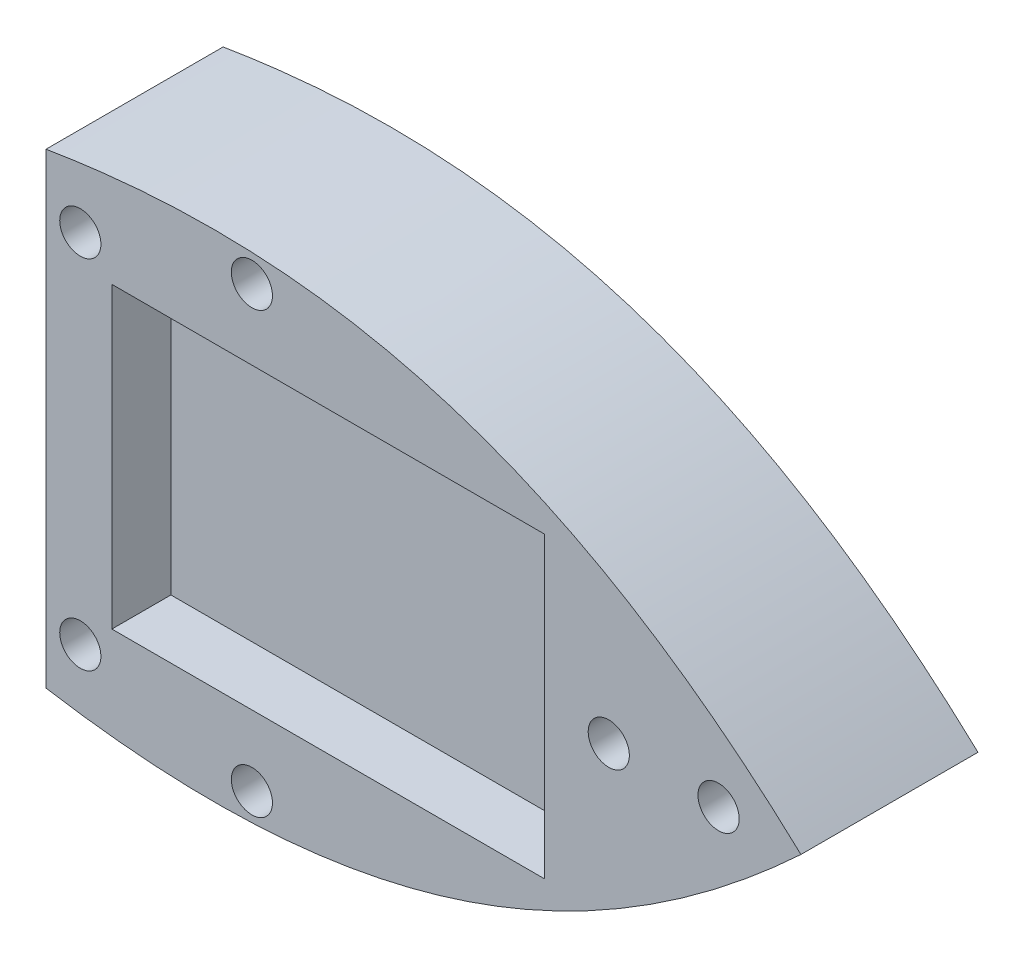
ISO-10303-21;
HEADER;
FILE_DESCRIPTION(('STEP AP214'),'2;1');
FILE_NAME('part.step','',(''),(''),'','','');
FILE_SCHEMA(('AUTOMOTIVE_DESIGN { 1 0 10303 214 1 1 1 1 }'));
ENDSEC;
DATA;
#1=APPLICATION_CONTEXT('core data for automotive mechanical design processes');
#2=APPLICATION_PROTOCOL_DEFINITION('international standard','automotive_design',2000,#1);
#3=PRODUCT_CONTEXT('',#1,'mechanical');
#4=PRODUCT('Part','Part','',(#3));
#5=PRODUCT_RELATED_PRODUCT_CATEGORY('part','',(#4));
#6=PRODUCT_DEFINITION_FORMATION('','',#4);
#7=PRODUCT_DEFINITION_CONTEXT('part definition',#1,'design');
#8=PRODUCT_DEFINITION('design','',#6,#7);
#9=PRODUCT_DEFINITION_SHAPE('','',#8);
#10=(LENGTH_UNIT() NAMED_UNIT(*) SI_UNIT(.MILLI.,.METRE.));
#11=(NAMED_UNIT(*) PLANE_ANGLE_UNIT() SI_UNIT($,.RADIAN.));
#12=(NAMED_UNIT(*) SI_UNIT($,.STERADIAN.) SOLID_ANGLE_UNIT());
#13=UNCERTAINTY_MEASURE_WITH_UNIT(LENGTH_MEASURE(1.E-05),#10,'distance_accuracy_value','');
#14=(GEOMETRIC_REPRESENTATION_CONTEXT(3) GLOBAL_UNCERTAINTY_ASSIGNED_CONTEXT((#13)) GLOBAL_UNIT_ASSIGNED_CONTEXT((#10,
#11,#12)) REPRESENTATION_CONTEXT('',''));
#15=CARTESIAN_POINT('',(0.,0.,0.));
#16=DIRECTION('',(0.,0.,1.));
#17=DIRECTION('',(1.,0.,0.));
#18=AXIS2_PLACEMENT_3D('',#15,#16,#17);
#19=CARTESIAN_POINT('',(1.27377448257759,15.7223087062875,12.9));
#20=DIRECTION('',(0.,0.,1.));
#21=DIRECTION('',(1.,0.,0.));
#22=AXIS2_PLACEMENT_3D('',#19,#20,#21);
#23=PLANE('',#22);
#24=CARTESIAN_POINT('',(-12.5,-16.,12.9));
#25=DIRECTION('',(0.,0.,1.));
#26=DIRECTION('',(-1.,0.,0.));
#27=AXIS2_PLACEMENT_3D('',#24,#25,#26);
#28=CIRCLE('',#27,1.5);
#29=CARTESIAN_POINT('',(-14.,-16.,12.9));
#30=VERTEX_POINT('',#29);
#31=EDGE_CURVE('E162',#30,#30,#28,.T.);
#32=ORIENTED_EDGE('',*,*,#31,.F.);
#33=EDGE_LOOP('',(#32));
#34=FACE_BOUND('',#33,.T.);
#35=CARTESIAN_POINT('',(21.5,0.,12.9));
#36=DIRECTION('',(0.,0.,1.));
#37=DIRECTION('',(1.,0.,0.));
#38=AXIS2_PLACEMENT_3D('',#35,#36,#37);
#39=CIRCLE('',#38,1.5);
#40=CARTESIAN_POINT('',(20.,0.,12.9));
#41=VERTEX_POINT('',#40);
#42=EDGE_CURVE('E178',#41,#41,#39,.T.);
#43=ORIENTED_EDGE('',*,*,#42,.F.);
#44=EDGE_LOOP('',(#43));
#45=FACE_BOUND('',#44,.T.);
#46=CARTESIAN_POINT('',(-25.,13.,12.9));
#47=DIRECTION('',(0.,0.,1.));
#48=DIRECTION('',(1.,0.,0.));
#49=AXIS2_PLACEMENT_3D('',#46,#47,#48);
#50=CIRCLE('',#49,1.5);
#51=CARTESIAN_POINT('',(-26.5,13.,12.9));
#52=VERTEX_POINT('',#51);
#53=EDGE_CURVE('E194',#52,#52,#50,.T.);
#54=ORIENTED_EDGE('',*,*,#53,.F.);
#55=EDGE_LOOP('',(#54));
#56=FACE_BOUND('',#55,.T.);
#57=CARTESIAN_POINT('',(27.5,0.,12.9));
#58=CARTESIAN_POINT('',(10.5144592111062,15.8596669110894,12.9));
#59=CARTESIAN_POINT('',(-7.11772725756596,20.399822972344,12.9));
#60=CARTESIAN_POINT('',(-27.5,17.,12.9));
#61=B_SPLINE_CURVE_WITH_KNOTS('',3,(#57,#58,#59,#60),.UNSPECIFIED.,.F.,.F.,(4,4),(0.,1.),.UNSPECIFIED.);
#62=CARTESIAN_POINT('',(27.5,0.,12.9));
#63=VERTEX_POINT('',#62);
#64=CARTESIAN_POINT('',(-27.5,17.,12.9));
#65=VERTEX_POINT('',#64);
#66=EDGE_CURVE('E201',#63,#65,#61,.T.);
#67=ORIENTED_EDGE('',*,*,#66,.T.);
#68=DIRECTION('',(0.,-1.,0.));
#69=VECTOR('',#68,1.);
#70=CARTESIAN_POINT('',(-27.5,-17.,12.9));
#71=LINE('',#70,#69);
#72=CARTESIAN_POINT('',(-27.5,-17.,12.9));
#73=VERTEX_POINT('',#72);
#74=EDGE_CURVE('E208',#65,#73,#71,.T.);
#75=ORIENTED_EDGE('',*,*,#74,.T.);
#76=CARTESIAN_POINT('',(-27.5,-17.,12.9));
#77=CARTESIAN_POINT('',(-7.11772725756596,-20.399822972344,12.9));
#78=CARTESIAN_POINT('',(10.5144592111062,-15.8596669110894,12.9));
#79=CARTESIAN_POINT('',(27.5,0.,12.9));
#80=B_SPLINE_CURVE_WITH_KNOTS('',3,(#76,#77,#78,#79),.UNSPECIFIED.,.F.,.F.,(4,4),(0.,1.),.UNSPECIFIED.);
#81=EDGE_CURVE('E215',#73,#63,#80,.T.);
#82=ORIENTED_EDGE('',*,*,#81,.T.);
#83=EDGE_LOOP('',(#67,#75,#82));
#84=FACE_BOUND('',#83,.T.);
#85=CARTESIAN_POINT('',(-12.5,16.,12.9));
#86=DIRECTION('',(0.,0.,1.));
#87=DIRECTION('',(1.,0.,0.));
#88=AXIS2_PLACEMENT_3D('',#85,#86,#87);
#89=CIRCLE('',#88,1.5);
#90=CARTESIAN_POINT('',(-14.,16.,12.9));
#91=VERTEX_POINT('',#90);
#92=EDGE_CURVE('E186',#91,#91,#89,.T.);
#93=ORIENTED_EDGE('',*,*,#92,.F.);
#94=EDGE_LOOP('',(#93));
#95=FACE_BOUND('',#94,.T.);
#96=CARTESIAN_POINT('',(13.5,0.,12.9));
#97=DIRECTION('',(0.,0.,1.));
#98=DIRECTION('',(1.,0.,0.));
#99=AXIS2_PLACEMENT_3D('',#96,#97,#98);
#100=CIRCLE('',#99,1.5);
#101=CARTESIAN_POINT('',(12.,0.,12.9));
#102=VERTEX_POINT('',#101);
#103=EDGE_CURVE('E170',#102,#102,#100,.T.);
#104=ORIENTED_EDGE('',*,*,#103,.F.);
#105=EDGE_LOOP('',(#104));
#106=FACE_BOUND('',#105,.T.);
#107=CARTESIAN_POINT('',(-25.,-13.,12.9));
#108=DIRECTION('',(0.,0.,1.));
#109=DIRECTION('',(-1.,0.,0.));
#110=AXIS2_PLACEMENT_3D('',#107,#108,#109);
#111=CIRCLE('',#110,1.5);
#112=CARTESIAN_POINT('',(-26.5,-13.,12.9));
#113=VERTEX_POINT('',#112);
#114=EDGE_CURVE('E154',#113,#113,#111,.T.);
#115=ORIENTED_EDGE('',*,*,#114,.F.);
#116=EDGE_LOOP('',(#115));
#117=FACE_BOUND('',#116,.T.);
#118=DIRECTION('',(1.,0.,0.));
#119=VECTOR('',#118,1.);
#120=CARTESIAN_POINT('',(8.8,-10.875,12.9));
#121=LINE('',#120,#119);
#122=CARTESIAN_POINT('',(-22.7,-10.875,12.9));
#123=VERTEX_POINT('',#122);
#124=CARTESIAN_POINT('',(8.8,-10.875,12.9));
#125=VERTEX_POINT('',#124);
#126=EDGE_CURVE('E137',#123,#125,#121,.T.);
#127=ORIENTED_EDGE('',*,*,#126,.F.);
#128=DIRECTION('',(0.,-1.,0.));
#129=VECTOR('',#128,1.);
#130=CARTESIAN_POINT('',(-22.7,-10.875,12.9));
#131=LINE('',#130,#129);
#132=CARTESIAN_POINT('',(-22.7,10.875,12.9));
#133=VERTEX_POINT('',#132);
#134=EDGE_CURVE('E134',#133,#123,#131,.T.);
#135=ORIENTED_EDGE('',*,*,#134,.F.);
#136=DIRECTION('',(-1.,0.,0.));
#137=VECTOR('',#136,1.);
#138=CARTESIAN_POINT('',(8.8,10.875,12.9));
#139=LINE('',#138,#137);
#140=CARTESIAN_POINT('',(8.8,10.875,12.9));
#141=VERTEX_POINT('',#140);
#142=EDGE_CURVE('E113',#141,#133,#139,.T.);
#143=ORIENTED_EDGE('',*,*,#142,.F.);
#144=DIRECTION('',(0.,1.,0.));
#145=VECTOR('',#144,1.);
#146=CARTESIAN_POINT('',(8.8,-10.875,12.9));
#147=LINE('',#146,#145);
#148=EDGE_CURVE('E140',#125,#141,#147,.T.);
#149=ORIENTED_EDGE('',*,*,#148,.F.);
#150=EDGE_LOOP('',(#127,#135,#143,#149));
#151=FACE_BOUND('',#150,.T.);
#152=ADVANCED_FACE('F44',(#34,#45,#56,#84,#95,#106,#117,#151),#23,.T.);
#153=CARTESIAN_POINT('',(1.27377448257759,15.7223087062875,0.));
#154=DIRECTION('',(0.,0.,1.));
#155=DIRECTION('',(1.,0.,0.));
#156=AXIS2_PLACEMENT_3D('',#153,#154,#155);
#157=PLANE('',#156);
#158=CARTESIAN_POINT('',(-25.,-13.,0.));
#159=DIRECTION('',(0.,0.,1.));
#160=DIRECTION('',(-1.,0.,0.));
#161=AXIS2_PLACEMENT_3D('',#158,#159,#160);
#162=CIRCLE('',#161,1.5);
#163=CARTESIAN_POINT('',(-26.5,-13.,0.));
#164=VERTEX_POINT('',#163);
#165=EDGE_CURVE('E153',#164,#164,#162,.T.);
#166=ORIENTED_EDGE('',*,*,#165,.T.);
#167=EDGE_LOOP('',(#166));
#168=FACE_BOUND('',#167,.T.);
#169=CARTESIAN_POINT('',(-12.5,-16.,0.));
#170=DIRECTION('',(0.,0.,1.));
#171=DIRECTION('',(-1.,0.,0.));
#172=AXIS2_PLACEMENT_3D('',#169,#170,#171);
#173=CIRCLE('',#172,1.5);
#174=CARTESIAN_POINT('',(-14.,-16.,0.));
#175=VERTEX_POINT('',#174);
#176=EDGE_CURVE('E158',#175,#175,#173,.T.);
#177=ORIENTED_EDGE('',*,*,#176,.T.);
#178=EDGE_LOOP('',(#177));
#179=FACE_BOUND('',#178,.T.);
#180=CARTESIAN_POINT('',(13.5,0.,0.));
#181=DIRECTION('',(0.,0.,1.));
#182=DIRECTION('',(1.,0.,0.));
#183=AXIS2_PLACEMENT_3D('',#180,#181,#182);
#184=CIRCLE('',#183,1.5);
#185=CARTESIAN_POINT('',(12.,0.,0.));
#186=VERTEX_POINT('',#185);
#187=EDGE_CURVE('E166',#186,#186,#184,.T.);
#188=ORIENTED_EDGE('',*,*,#187,.T.);
#189=EDGE_LOOP('',(#188));
#190=FACE_BOUND('',#189,.T.);
#191=CARTESIAN_POINT('',(21.5,0.,0.));
#192=DIRECTION('',(0.,0.,1.));
#193=DIRECTION('',(1.,0.,0.));
#194=AXIS2_PLACEMENT_3D('',#191,#192,#193);
#195=CIRCLE('',#194,1.5);
#196=CARTESIAN_POINT('',(20.,0.,0.));
#197=VERTEX_POINT('',#196);
#198=EDGE_CURVE('E174',#197,#197,#195,.T.);
#199=ORIENTED_EDGE('',*,*,#198,.T.);
#200=EDGE_LOOP('',(#199));
#201=FACE_BOUND('',#200,.T.);
#202=CARTESIAN_POINT('',(-12.5,16.,0.));
#203=DIRECTION('',(0.,0.,1.));
#204=DIRECTION('',(1.,0.,0.));
#205=AXIS2_PLACEMENT_3D('',#202,#203,#204);
#206=CIRCLE('',#205,1.5);
#207=CARTESIAN_POINT('',(-14.,16.,0.));
#208=VERTEX_POINT('',#207);
#209=EDGE_CURVE('E182',#208,#208,#206,.T.);
#210=ORIENTED_EDGE('',*,*,#209,.T.);
#211=EDGE_LOOP('',(#210));
#212=FACE_BOUND('',#211,.T.);
#213=CARTESIAN_POINT('',(-25.,13.,0.));
#214=DIRECTION('',(0.,0.,1.));
#215=DIRECTION('',(1.,0.,0.));
#216=AXIS2_PLACEMENT_3D('',#213,#214,#215);
#217=CIRCLE('',#216,1.5);
#218=CARTESIAN_POINT('',(-26.5,13.,0.));
#219=VERTEX_POINT('',#218);
#220=EDGE_CURVE('E190',#219,#219,#217,.T.);
#221=ORIENTED_EDGE('',*,*,#220,.T.);
#222=EDGE_LOOP('',(#221));
#223=FACE_BOUND('',#222,.T.);
#224=CARTESIAN_POINT('',(27.5,0.,0.));
#225=CARTESIAN_POINT('',(10.5144592111062,15.8596669110894,0.));
#226=CARTESIAN_POINT('',(-7.11772725756596,20.399822972344,0.));
#227=CARTESIAN_POINT('',(-27.5,17.,0.));
#228=B_SPLINE_CURVE_WITH_KNOTS('',3,(#224,#225,#226,#227),.UNSPECIFIED.,.F.,.F.,(4,4),(0.,1.),.UNSPECIFIED.);
#229=CARTESIAN_POINT('',(27.5,0.,0.));
#230=VERTEX_POINT('',#229);
#231=CARTESIAN_POINT('',(-27.5,17.,0.));
#232=VERTEX_POINT('',#231);
#233=EDGE_CURVE('E198',#230,#232,#228,.T.);
#234=ORIENTED_EDGE('',*,*,#233,.F.);
#235=CARTESIAN_POINT('',(-27.5,-17.,0.));
#236=CARTESIAN_POINT('',(-7.11772725756596,-20.399822972344,0.));
#237=CARTESIAN_POINT('',(10.5144592111062,-15.8596669110894,0.));
#238=CARTESIAN_POINT('',(27.5,0.,0.));
#239=B_SPLINE_CURVE_WITH_KNOTS('',3,(#235,#236,#237,#238),.UNSPECIFIED.,.F.,.F.,(4,4),(0.,1.),.UNSPECIFIED.);
#240=CARTESIAN_POINT('',(-27.5,-17.,0.));
#241=VERTEX_POINT('',#240);
#242=EDGE_CURVE('E209',#241,#230,#239,.T.);
#243=ORIENTED_EDGE('',*,*,#242,.F.);
#244=DIRECTION('',(0.,-1.,0.));
#245=VECTOR('',#244,1.);
#246=CARTESIAN_POINT('',(-27.5,-17.,0.));
#247=LINE('',#246,#245);
#248=EDGE_CURVE('E430',#232,#241,#247,.T.);
#249=ORIENTED_EDGE('',*,*,#248,.F.);
#250=EDGE_LOOP('',(#234,#243,#249));
#251=FACE_BOUND('',#250,.T.);
#252=ADVANCED_FACE('F235',(#168,#179,#190,#201,#212,#223,#251),#157,.F.);
#253=DIRECTION('',(0.,0.,-1.));
#254=VECTOR('',#253,1.);
#255=SURFACE_OF_LINEAR_EXTRUSION('',#61,#254);
#256=ORIENTED_EDGE('',*,*,#233,.T.);
#257=DIRECTION('',(0.,0.,-1.));
#258=VECTOR('',#257,1.);
#259=CARTESIAN_POINT('',(-27.5,17.,12.9));
#260=LINE('',#259,#258);
#261=EDGE_CURVE('E11',#65,#232,#260,.T.);
#262=ORIENTED_EDGE('',*,*,#261,.F.);
#263=ORIENTED_EDGE('',*,*,#66,.F.);
#264=DIRECTION('',(0.,0.,-1.));
#265=VECTOR('',#264,1.);
#266=CARTESIAN_POINT('',(27.5,0.,12.9));
#267=LINE('',#266,#265);
#268=EDGE_CURVE('E221',#63,#230,#267,.T.);
#269=ORIENTED_EDGE('',*,*,#268,.T.);
#270=EDGE_LOOP('',(#256,#262,#263,#269));
#271=FACE_BOUND('',#270,.T.);
#272=ADVANCED_FACE('F46',(#271),#255,.F.);
#273=CARTESIAN_POINT('',(-27.5,-17.,12.9));
#274=DIRECTION('',(1.,0.,0.));
#275=DIRECTION('',(0.,0.,-1.));
#276=AXIS2_PLACEMENT_3D('',#273,#274,#275);
#277=PLANE('',#276);
#278=ORIENTED_EDGE('',*,*,#248,.T.);
#279=DIRECTION('',(0.,0.,-1.));
#280=VECTOR('',#279,1.);
#281=CARTESIAN_POINT('',(-27.5,-17.,12.9));
#282=LINE('',#281,#280);
#283=EDGE_CURVE('E54',#73,#241,#282,.T.);
#284=ORIENTED_EDGE('',*,*,#283,.F.);
#285=ORIENTED_EDGE('',*,*,#74,.F.);
#286=ORIENTED_EDGE('',*,*,#261,.T.);
#287=EDGE_LOOP('',(#278,#284,#285,#286));
#288=FACE_BOUND('',#287,.T.);
#289=ADVANCED_FACE('F233',(#288),#277,.F.);
#290=DIRECTION('',(0.,0.,-1.));
#291=VECTOR('',#290,1.);
#292=SURFACE_OF_LINEAR_EXTRUSION('',#80,#291);
#293=ORIENTED_EDGE('',*,*,#242,.T.);
#294=ORIENTED_EDGE('',*,*,#268,.F.);
#295=ORIENTED_EDGE('',*,*,#81,.F.);
#296=ORIENTED_EDGE('',*,*,#283,.T.);
#297=EDGE_LOOP('',(#293,#294,#295,#296));
#298=FACE_BOUND('',#297,.T.);
#299=ADVANCED_FACE('F229',(#298),#292,.F.);
#300=CARTESIAN_POINT('',(-25.,13.,12.9));
#301=DIRECTION('',(0.,0.,-1.));
#302=DIRECTION('',(-1.,0.,0.));
#303=AXIS2_PLACEMENT_3D('',#300,#301,#302);
#304=CYLINDRICAL_SURFACE('',#303,1.5);
#305=CARTESIAN_POINT('',(-26.5,13.,12.9));
#306=CARTESIAN_POINT('',(-26.5,13.,12.765625));
#307=CARTESIAN_POINT('',(-26.5,13.,12.63125));
#308=CARTESIAN_POINT('',(-26.5,13.,12.3625));
#309=CARTESIAN_POINT('',(-26.5,13.,12.228125));
#310=CARTESIAN_POINT('',(-26.5,13.,11.959375));
#311=CARTESIAN_POINT('',(-26.5,13.,11.825));
#312=CARTESIAN_POINT('',(-26.5,13.,11.55625));
#313=CARTESIAN_POINT('',(-26.5,13.,11.421875));
#314=CARTESIAN_POINT('',(-26.5,13.,11.153125));
#315=CARTESIAN_POINT('',(-26.5,13.,11.01875));
#316=CARTESIAN_POINT('',(-26.5,13.,10.75));
#317=CARTESIAN_POINT('',(-26.5,13.,10.615625));
#318=CARTESIAN_POINT('',(-26.5,13.,10.346875));
#319=CARTESIAN_POINT('',(-26.5,13.,10.2125));
#320=CARTESIAN_POINT('',(-26.5,13.,9.94375));
#321=CARTESIAN_POINT('',(-26.5,13.,9.809375));
#322=CARTESIAN_POINT('',(-26.5,13.,9.540625));
#323=CARTESIAN_POINT('',(-26.5,13.,9.40625));
#324=CARTESIAN_POINT('',(-26.5,13.,9.1375));
#325=CARTESIAN_POINT('',(-26.5,13.,9.003125));
#326=CARTESIAN_POINT('',(-26.5,13.,8.734375));
#327=CARTESIAN_POINT('',(-26.5,13.,8.6));
#328=CARTESIAN_POINT('',(-26.5,13.,8.33125));
#329=CARTESIAN_POINT('',(-26.5,13.,8.196875));
#330=CARTESIAN_POINT('',(-26.5,13.,7.928125));
#331=CARTESIAN_POINT('',(-26.5,13.,7.79375));
#332=CARTESIAN_POINT('',(-26.5,13.,7.525));
#333=CARTESIAN_POINT('',(-26.5,13.,7.390625));
#334=CARTESIAN_POINT('',(-26.5,13.,7.121875));
#335=CARTESIAN_POINT('',(-26.5,13.,6.9875));
#336=CARTESIAN_POINT('',(-26.5,13.,6.71875));
#337=CARTESIAN_POINT('',(-26.5,13.,6.584375));
#338=CARTESIAN_POINT('',(-26.5,13.,6.315625));
#339=CARTESIAN_POINT('',(-26.5,13.,6.18125));
#340=CARTESIAN_POINT('',(-26.5,13.,5.9125));
#341=CARTESIAN_POINT('',(-26.5,13.,5.778125));
#342=CARTESIAN_POINT('',(-26.5,13.,5.509375));
#343=CARTESIAN_POINT('',(-26.5,13.,5.375));
#344=CARTESIAN_POINT('',(-26.5,13.,5.10625));
#345=CARTESIAN_POINT('',(-26.5,13.,4.971875));
#346=CARTESIAN_POINT('',(-26.5,13.,4.703125));
#347=CARTESIAN_POINT('',(-26.5,13.,4.56875));
#348=CARTESIAN_POINT('',(-26.5,13.,4.3));
#349=CARTESIAN_POINT('',(-26.5,13.,4.165625));
#350=CARTESIAN_POINT('',(-26.5,13.,3.896875));
#351=CARTESIAN_POINT('',(-26.5,13.,3.7625));
#352=CARTESIAN_POINT('',(-26.5,13.,3.49375));
#353=CARTESIAN_POINT('',(-26.5,13.,3.359375));
#354=CARTESIAN_POINT('',(-26.5,13.,3.090625));
#355=CARTESIAN_POINT('',(-26.5,13.,2.95625));
#356=CARTESIAN_POINT('',(-26.5,13.,2.6875));
#357=CARTESIAN_POINT('',(-26.5,13.,2.553125));
#358=CARTESIAN_POINT('',(-26.5,13.,2.284375));
#359=CARTESIAN_POINT('',(-26.5,13.,2.15));
#360=CARTESIAN_POINT('',(-26.5,13.,1.88125));
#361=CARTESIAN_POINT('',(-26.5,13.,1.746875));
#362=CARTESIAN_POINT('',(-26.5,13.,1.478125));
#363=CARTESIAN_POINT('',(-26.5,13.,1.34375));
#364=CARTESIAN_POINT('',(-26.5,13.,1.075));
#365=CARTESIAN_POINT('',(-26.5,13.,0.940625));
#366=CARTESIAN_POINT('',(-26.5,13.,0.671875));
#367=CARTESIAN_POINT('',(-26.5,13.,0.5375));
#368=CARTESIAN_POINT('',(-26.5,13.,0.268750000000001));
#369=CARTESIAN_POINT('',(-26.5,13.,0.134375));
#370=CARTESIAN_POINT('',(-26.5,13.,0.));
#371=B_SPLINE_CURVE_WITH_KNOTS('',3,(#305,#306,#307,#308,#309,#310,#311,#312,#313,#314,#315,
#316,#317,#318,#319,#320,#321,#322,#323,#324,#325,#326,#327,#328,#329,#330,#331,#332,#333,#334,
#335,#336,#337,#338,#339,#340,#341,#342,#343,#344,#345,#346,#347,#348,#349,#350,#351,#352,#353,
#354,#355,#356,#357,#358,#359,#360,#361,#362,#363,#364,#365,#366,#367,#368,#369,#370),
.UNSPECIFIED.,.F.,.F.,(4,2,2,2,2,2,2,2,2,2,2,2,2,2,2,2,2,2,2,2,2,2,2,2,2,2,2,2,2,2,2,2,4),(0.,
0.403125000000001,0.806250000000001,1.209375,1.6125,2.015625,2.41875,2.821875,3.225,3.628125,
4.03125,4.434375,4.8375,5.240625,5.64375,6.046875,6.45,6.853125,7.25625,7.659375,8.0625,
8.465625,8.86875,9.271875,9.675,10.078125,10.48125,10.884375,11.2875,11.690625,12.09375,
12.496875,12.9),.UNSPECIFIED.);
#372=EDGE_CURVE('BSEAM232',#52,#219,#371,.T.);
#373=ORIENTED_EDGE('',*,*,#53,.T.);
#374=ORIENTED_EDGE('',*,*,#220,.F.);
#375=ORIENTED_EDGE('',*,*,#372,.T.);
#376=ORIENTED_EDGE('',*,*,#372,.F.);
#377=EDGE_LOOP('',(#373,#375,#374,#376));
#378=FACE_BOUND('',#377,.T.);
#379=ADVANCED_FACE('F232',(#378),#304,.F.);
#380=CARTESIAN_POINT('',(-12.5,16.,12.9));
#381=DIRECTION('',(0.,0.,-1.));
#382=DIRECTION('',(-1.,0.,0.));
#383=AXIS2_PLACEMENT_3D('',#380,#381,#382);
#384=CYLINDRICAL_SURFACE('',#383,1.5);
#385=CARTESIAN_POINT('',(-14.,16.,12.9));
#386=CARTESIAN_POINT('',(-14.,16.,12.765625));
#387=CARTESIAN_POINT('',(-14.,16.,12.63125));
#388=CARTESIAN_POINT('',(-14.,16.,12.3625));
#389=CARTESIAN_POINT('',(-14.,16.,12.228125));
#390=CARTESIAN_POINT('',(-14.,16.,11.959375));
#391=CARTESIAN_POINT('',(-14.,16.,11.825));
#392=CARTESIAN_POINT('',(-14.,16.,11.55625));
#393=CARTESIAN_POINT('',(-14.,16.,11.421875));
#394=CARTESIAN_POINT('',(-14.,16.,11.153125));
#395=CARTESIAN_POINT('',(-14.,16.,11.01875));
#396=CARTESIAN_POINT('',(-14.,16.,10.75));
#397=CARTESIAN_POINT('',(-14.,16.,10.615625));
#398=CARTESIAN_POINT('',(-14.,16.,10.346875));
#399=CARTESIAN_POINT('',(-14.,16.,10.2125));
#400=CARTESIAN_POINT('',(-14.,16.,9.94375));
#401=CARTESIAN_POINT('',(-14.,16.,9.809375));
#402=CARTESIAN_POINT('',(-14.,16.,9.540625));
#403=CARTESIAN_POINT('',(-14.,16.,9.40625));
#404=CARTESIAN_POINT('',(-14.,16.,9.1375));
#405=CARTESIAN_POINT('',(-14.,16.,9.003125));
#406=CARTESIAN_POINT('',(-14.,16.,8.734375));
#407=CARTESIAN_POINT('',(-14.,16.,8.6));
#408=CARTESIAN_POINT('',(-14.,16.,8.33125));
#409=CARTESIAN_POINT('',(-14.,16.,8.196875));
#410=CARTESIAN_POINT('',(-14.,16.,7.928125));
#411=CARTESIAN_POINT('',(-14.,16.,7.79375));
#412=CARTESIAN_POINT('',(-14.,16.,7.525));
#413=CARTESIAN_POINT('',(-14.,16.,7.390625));
#414=CARTESIAN_POINT('',(-14.,16.,7.121875));
#415=CARTESIAN_POINT('',(-14.,16.,6.9875));
#416=CARTESIAN_POINT('',(-14.,16.,6.71875));
#417=CARTESIAN_POINT('',(-14.,16.,6.584375));
#418=CARTESIAN_POINT('',(-14.,16.,6.315625));
#419=CARTESIAN_POINT('',(-14.,16.,6.18125));
#420=CARTESIAN_POINT('',(-14.,16.,5.9125));
#421=CARTESIAN_POINT('',(-14.,16.,5.778125));
#422=CARTESIAN_POINT('',(-14.,16.,5.509375));
#423=CARTESIAN_POINT('',(-14.,16.,5.375));
#424=CARTESIAN_POINT('',(-14.,16.,5.10625));
#425=CARTESIAN_POINT('',(-14.,16.,4.971875));
#426=CARTESIAN_POINT('',(-14.,16.,4.703125));
#427=CARTESIAN_POINT('',(-14.,16.,4.56875));
#428=CARTESIAN_POINT('',(-14.,16.,4.3));
#429=CARTESIAN_POINT('',(-14.,16.,4.165625));
#430=CARTESIAN_POINT('',(-14.,16.,3.896875));
#431=CARTESIAN_POINT('',(-14.,16.,3.7625));
#432=CARTESIAN_POINT('',(-14.,16.,3.49375));
#433=CARTESIAN_POINT('',(-14.,16.,3.359375));
#434=CARTESIAN_POINT('',(-14.,16.,3.090625));
#435=CARTESIAN_POINT('',(-14.,16.,2.95625));
#436=CARTESIAN_POINT('',(-14.,16.,2.6875));
#437=CARTESIAN_POINT('',(-14.,16.,2.553125));
#438=CARTESIAN_POINT('',(-14.,16.,2.284375));
#439=CARTESIAN_POINT('',(-14.,16.,2.15));
#440=CARTESIAN_POINT('',(-14.,16.,1.88125));
#441=CARTESIAN_POINT('',(-14.,16.,1.746875));
#442=CARTESIAN_POINT('',(-14.,16.,1.478125));
#443=CARTESIAN_POINT('',(-14.,16.,1.34375));
#444=CARTESIAN_POINT('',(-14.,16.,1.075));
#445=CARTESIAN_POINT('',(-14.,16.,0.940625));
#446=CARTESIAN_POINT('',(-14.,16.,0.671875));
#447=CARTESIAN_POINT('',(-14.,16.,0.5375));
#448=CARTESIAN_POINT('',(-14.,16.,0.268750000000001));
#449=CARTESIAN_POINT('',(-14.,16.,0.134375));
#450=CARTESIAN_POINT('',(-14.,16.,0.));
#451=B_SPLINE_CURVE_WITH_KNOTS('',3,(#385,#386,#387,#388,#389,#390,#391,#392,#393,#394,#395,
#396,#397,#398,#399,#400,#401,#402,#403,#404,#405,#406,#407,#408,#409,#410,#411,#412,#413,#414,
#415,#416,#417,#418,#419,#420,#421,#422,#423,#424,#425,#426,#427,#428,#429,#430,#431,#432,#433,
#434,#435,#436,#437,#438,#439,#440,#441,#442,#443,#444,#445,#446,#447,#448,#449,#450),
.UNSPECIFIED.,.F.,.F.,(4,2,2,2,2,2,2,2,2,2,2,2,2,2,2,2,2,2,2,2,2,2,2,2,2,2,2,2,2,2,2,2,4),(0.,
0.403125000000001,0.806250000000001,1.209375,1.6125,2.015625,2.41875,2.821875,3.225,3.628125,
4.03125,4.434375,4.8375,5.240625,5.64375,6.046875,6.45,6.853125,7.25625,7.659375,8.0625,
8.465625,8.86875,9.271875,9.675,10.078125,10.48125,10.884375,11.2875,11.690625,12.09375,
12.496875,12.9),.UNSPECIFIED.);
#452=EDGE_CURVE('BSEAM254',#91,#208,#451,.T.);
#453=ORIENTED_EDGE('',*,*,#92,.T.);
#454=ORIENTED_EDGE('',*,*,#209,.F.);
#455=ORIENTED_EDGE('',*,*,#452,.T.);
#456=ORIENTED_EDGE('',*,*,#452,.F.);
#457=EDGE_LOOP('',(#453,#455,#454,#456));
#458=FACE_BOUND('',#457,.T.);
#459=ADVANCED_FACE('F254',(#458),#384,.F.);
#460=CARTESIAN_POINT('',(21.5,0.,12.9));
#461=DIRECTION('',(0.,0.,-1.));
#462=DIRECTION('',(-1.,0.,0.));
#463=AXIS2_PLACEMENT_3D('',#460,#461,#462);
#464=CYLINDRICAL_SURFACE('',#463,1.5);
#465=CARTESIAN_POINT('',(20.,0.,12.9));
#466=CARTESIAN_POINT('',(20.,0.,12.765625));
#467=CARTESIAN_POINT('',(20.,0.,12.63125));
#468=CARTESIAN_POINT('',(20.,0.,12.3625));
#469=CARTESIAN_POINT('',(20.,0.,12.228125));
#470=CARTESIAN_POINT('',(20.,0.,11.959375));
#471=CARTESIAN_POINT('',(20.,0.,11.825));
#472=CARTESIAN_POINT('',(20.,0.,11.55625));
#473=CARTESIAN_POINT('',(20.,0.,11.421875));
#474=CARTESIAN_POINT('',(20.,0.,11.153125));
#475=CARTESIAN_POINT('',(20.,0.,11.01875));
#476=CARTESIAN_POINT('',(20.,0.,10.75));
#477=CARTESIAN_POINT('',(20.,0.,10.615625));
#478=CARTESIAN_POINT('',(20.,0.,10.346875));
#479=CARTESIAN_POINT('',(20.,0.,10.2125));
#480=CARTESIAN_POINT('',(20.,0.,9.94375));
#481=CARTESIAN_POINT('',(20.,0.,9.809375));
#482=CARTESIAN_POINT('',(20.,0.,9.540625));
#483=CARTESIAN_POINT('',(20.,0.,9.40625));
#484=CARTESIAN_POINT('',(20.,0.,9.1375));
#485=CARTESIAN_POINT('',(20.,0.,9.003125));
#486=CARTESIAN_POINT('',(20.,0.,8.734375));
#487=CARTESIAN_POINT('',(20.,0.,8.6));
#488=CARTESIAN_POINT('',(20.,0.,8.33125));
#489=CARTESIAN_POINT('',(20.,0.,8.196875));
#490=CARTESIAN_POINT('',(20.,0.,7.928125));
#491=CARTESIAN_POINT('',(20.,0.,7.79375));
#492=CARTESIAN_POINT('',(20.,0.,7.525));
#493=CARTESIAN_POINT('',(20.,0.,7.390625));
#494=CARTESIAN_POINT('',(20.,0.,7.121875));
#495=CARTESIAN_POINT('',(20.,0.,6.9875));
#496=CARTESIAN_POINT('',(20.,0.,6.71875));
#497=CARTESIAN_POINT('',(20.,0.,6.584375));
#498=CARTESIAN_POINT('',(20.,0.,6.315625));
#499=CARTESIAN_POINT('',(20.,0.,6.18125));
#500=CARTESIAN_POINT('',(20.,0.,5.9125));
#501=CARTESIAN_POINT('',(20.,0.,5.778125));
#502=CARTESIAN_POINT('',(20.,0.,5.509375));
#503=CARTESIAN_POINT('',(20.,0.,5.375));
#504=CARTESIAN_POINT('',(20.,0.,5.10625));
#505=CARTESIAN_POINT('',(20.,0.,4.971875));
#506=CARTESIAN_POINT('',(20.,0.,4.703125));
#507=CARTESIAN_POINT('',(20.,0.,4.56875));
#508=CARTESIAN_POINT('',(20.,0.,4.3));
#509=CARTESIAN_POINT('',(20.,0.,4.165625));
#510=CARTESIAN_POINT('',(20.,0.,3.896875));
#511=CARTESIAN_POINT('',(20.,0.,3.7625));
#512=CARTESIAN_POINT('',(20.,0.,3.49375));
#513=CARTESIAN_POINT('',(20.,0.,3.359375));
#514=CARTESIAN_POINT('',(20.,0.,3.090625));
#515=CARTESIAN_POINT('',(20.,0.,2.95625));
#516=CARTESIAN_POINT('',(20.,0.,2.6875));
#517=CARTESIAN_POINT('',(20.,0.,2.553125));
#518=CARTESIAN_POINT('',(20.,0.,2.284375));
#519=CARTESIAN_POINT('',(20.,0.,2.15));
#520=CARTESIAN_POINT('',(20.,0.,1.88125));
#521=CARTESIAN_POINT('',(20.,0.,1.746875));
#522=CARTESIAN_POINT('',(20.,0.,1.478125));
#523=CARTESIAN_POINT('',(20.,0.,1.34375));
#524=CARTESIAN_POINT('',(20.,0.,1.075));
#525=CARTESIAN_POINT('',(20.,0.,0.940625));
#526=CARTESIAN_POINT('',(20.,0.,0.671875));
#527=CARTESIAN_POINT('',(20.,0.,0.5375));
#528=CARTESIAN_POINT('',(20.,0.,0.268750000000001));
#529=CARTESIAN_POINT('',(20.,0.,0.134375));
#530=CARTESIAN_POINT('',(20.,0.,0.));
#531=B_SPLINE_CURVE_WITH_KNOTS('',3,(#465,#466,#467,#468,#469,#470,#471,#472,#473,#474,#475,
#476,#477,#478,#479,#480,#481,#482,#483,#484,#485,#486,#487,#488,#489,#490,#491,#492,#493,#494,
#495,#496,#497,#498,#499,#500,#501,#502,#503,#504,#505,#506,#507,#508,#509,#510,#511,#512,#513,
#514,#515,#516,#517,#518,#519,#520,#521,#522,#523,#524,#525,#526,#527,#528,#529,#530),
.UNSPECIFIED.,.F.,.F.,(4,2,2,2,2,2,2,2,2,2,2,2,2,2,2,2,2,2,2,2,2,2,2,2,2,2,2,2,2,2,2,2,4),(0.,
0.403125000000001,0.806250000000001,1.209375,1.6125,2.015625,2.41875,2.821875,3.225,3.628125,
4.03125,4.434375,4.8375,5.240625,5.64375,6.046875,6.45,6.853125,7.25625,7.659375,8.0625,
8.465625,8.86875,9.271875,9.675,10.078125,10.48125,10.884375,11.2875,11.690625,12.09375,
12.496875,12.9),.UNSPECIFIED.);
#532=EDGE_CURVE('BSEAM258',#41,#197,#531,.T.);
#533=ORIENTED_EDGE('',*,*,#42,.T.);
#534=ORIENTED_EDGE('',*,*,#198,.F.);
#535=ORIENTED_EDGE('',*,*,#532,.T.);
#536=ORIENTED_EDGE('',*,*,#532,.F.);
#537=EDGE_LOOP('',(#533,#535,#534,#536));
#538=FACE_BOUND('',#537,.T.);
#539=ADVANCED_FACE('F258',(#538),#464,.F.);
#540=CARTESIAN_POINT('',(13.5,0.,12.9));
#541=DIRECTION('',(0.,0.,-1.));
#542=DIRECTION('',(-1.,0.,0.));
#543=AXIS2_PLACEMENT_3D('',#540,#541,#542);
#544=CYLINDRICAL_SURFACE('',#543,1.5);
#545=CARTESIAN_POINT('',(12.,0.,12.9));
#546=CARTESIAN_POINT('',(12.,0.,12.765625));
#547=CARTESIAN_POINT('',(12.,0.,12.63125));
#548=CARTESIAN_POINT('',(12.,0.,12.3625));
#549=CARTESIAN_POINT('',(12.,0.,12.228125));
#550=CARTESIAN_POINT('',(12.,0.,11.959375));
#551=CARTESIAN_POINT('',(12.,0.,11.825));
#552=CARTESIAN_POINT('',(12.,0.,11.55625));
#553=CARTESIAN_POINT('',(12.,0.,11.421875));
#554=CARTESIAN_POINT('',(12.,0.,11.153125));
#555=CARTESIAN_POINT('',(12.,0.,11.01875));
#556=CARTESIAN_POINT('',(12.,0.,10.75));
#557=CARTESIAN_POINT('',(12.,0.,10.615625));
#558=CARTESIAN_POINT('',(12.,0.,10.346875));
#559=CARTESIAN_POINT('',(12.,0.,10.2125));
#560=CARTESIAN_POINT('',(12.,0.,9.94375));
#561=CARTESIAN_POINT('',(12.,0.,9.809375));
#562=CARTESIAN_POINT('',(12.,0.,9.540625));
#563=CARTESIAN_POINT('',(12.,0.,9.40625));
#564=CARTESIAN_POINT('',(12.,0.,9.1375));
#565=CARTESIAN_POINT('',(12.,0.,9.003125));
#566=CARTESIAN_POINT('',(12.,0.,8.734375));
#567=CARTESIAN_POINT('',(12.,0.,8.6));
#568=CARTESIAN_POINT('',(12.,0.,8.33125));
#569=CARTESIAN_POINT('',(12.,0.,8.196875));
#570=CARTESIAN_POINT('',(12.,0.,7.928125));
#571=CARTESIAN_POINT('',(12.,0.,7.79375));
#572=CARTESIAN_POINT('',(12.,0.,7.525));
#573=CARTESIAN_POINT('',(12.,0.,7.390625));
#574=CARTESIAN_POINT('',(12.,0.,7.121875));
#575=CARTESIAN_POINT('',(12.,0.,6.9875));
#576=CARTESIAN_POINT('',(12.,0.,6.71875));
#577=CARTESIAN_POINT('',(12.,0.,6.584375));
#578=CARTESIAN_POINT('',(12.,0.,6.315625));
#579=CARTESIAN_POINT('',(12.,0.,6.18125));
#580=CARTESIAN_POINT('',(12.,0.,5.9125));
#581=CARTESIAN_POINT('',(12.,0.,5.778125));
#582=CARTESIAN_POINT('',(12.,0.,5.509375));
#583=CARTESIAN_POINT('',(12.,0.,5.375));
#584=CARTESIAN_POINT('',(12.,0.,5.10625));
#585=CARTESIAN_POINT('',(12.,0.,4.971875));
#586=CARTESIAN_POINT('',(12.,0.,4.703125));
#587=CARTESIAN_POINT('',(12.,0.,4.56875));
#588=CARTESIAN_POINT('',(12.,0.,4.3));
#589=CARTESIAN_POINT('',(12.,0.,4.165625));
#590=CARTESIAN_POINT('',(12.,0.,3.896875));
#591=CARTESIAN_POINT('',(12.,0.,3.7625));
#592=CARTESIAN_POINT('',(12.,0.,3.49375));
#593=CARTESIAN_POINT('',(12.,0.,3.359375));
#594=CARTESIAN_POINT('',(12.,0.,3.090625));
#595=CARTESIAN_POINT('',(12.,0.,2.95625));
#596=CARTESIAN_POINT('',(12.,0.,2.6875));
#597=CARTESIAN_POINT('',(12.,0.,2.553125));
#598=CARTESIAN_POINT('',(12.,0.,2.284375));
#599=CARTESIAN_POINT('',(12.,0.,2.15));
#600=CARTESIAN_POINT('',(12.,0.,1.88125));
#601=CARTESIAN_POINT('',(12.,0.,1.746875));
#602=CARTESIAN_POINT('',(12.,0.,1.478125));
#603=CARTESIAN_POINT('',(12.,0.,1.34375));
#604=CARTESIAN_POINT('',(12.,0.,1.075));
#605=CARTESIAN_POINT('',(12.,0.,0.940625));
#606=CARTESIAN_POINT('',(12.,0.,0.671875));
#607=CARTESIAN_POINT('',(12.,0.,0.5375));
#608=CARTESIAN_POINT('',(12.,0.,0.268750000000001));
#609=CARTESIAN_POINT('',(12.,0.,0.134375));
#610=CARTESIAN_POINT('',(12.,0.,0.));
#611=B_SPLINE_CURVE_WITH_KNOTS('',3,(#545,#546,#547,#548,#549,#550,#551,#552,#553,#554,#555,
#556,#557,#558,#559,#560,#561,#562,#563,#564,#565,#566,#567,#568,#569,#570,#571,#572,#573,#574,
#575,#576,#577,#578,#579,#580,#581,#582,#583,#584,#585,#586,#587,#588,#589,#590,#591,#592,#593,
#594,#595,#596,#597,#598,#599,#600,#601,#602,#603,#604,#605,#606,#607,#608,#609,#610),
.UNSPECIFIED.,.F.,.F.,(4,2,2,2,2,2,2,2,2,2,2,2,2,2,2,2,2,2,2,2,2,2,2,2,2,2,2,2,2,2,2,2,4),(0.,
0.403125000000001,0.806250000000001,1.209375,1.6125,2.015625,2.41875,2.821875,3.225,3.628125,
4.03125,4.434375,4.8375,5.240625,5.64375,6.046875,6.45,6.853125,7.25625,7.659375,8.0625,
8.465625,8.86875,9.271875,9.675,10.078125,10.48125,10.884375,11.2875,11.690625,12.09375,
12.496875,12.9),.UNSPECIFIED.);
#612=EDGE_CURVE('BSEAM262',#102,#186,#611,.T.);
#613=ORIENTED_EDGE('',*,*,#103,.T.);
#614=ORIENTED_EDGE('',*,*,#187,.F.);
#615=ORIENTED_EDGE('',*,*,#612,.T.);
#616=ORIENTED_EDGE('',*,*,#612,.F.);
#617=EDGE_LOOP('',(#613,#615,#614,#616));
#618=FACE_BOUND('',#617,.T.);
#619=ADVANCED_FACE('F262',(#618),#544,.F.);
#620=CARTESIAN_POINT('',(-12.5,-16.,12.9));
#621=DIRECTION('',(0.,0.,-1.));
#622=DIRECTION('',(-1.,0.,0.));
#623=AXIS2_PLACEMENT_3D('',#620,#621,#622);
#624=CYLINDRICAL_SURFACE('',#623,1.5);
#625=CARTESIAN_POINT('',(-14.,-16.,12.9));
#626=CARTESIAN_POINT('',(-14.,-16.,12.765625));
#627=CARTESIAN_POINT('',(-14.,-16.,12.63125));
#628=CARTESIAN_POINT('',(-14.,-16.,12.3625));
#629=CARTESIAN_POINT('',(-14.,-16.,12.228125));
#630=CARTESIAN_POINT('',(-14.,-16.,11.959375));
#631=CARTESIAN_POINT('',(-14.,-16.,11.825));
#632=CARTESIAN_POINT('',(-14.,-16.,11.55625));
#633=CARTESIAN_POINT('',(-14.,-16.,11.421875));
#634=CARTESIAN_POINT('',(-14.,-16.,11.153125));
#635=CARTESIAN_POINT('',(-14.,-16.,11.01875));
#636=CARTESIAN_POINT('',(-14.,-16.,10.75));
#637=CARTESIAN_POINT('',(-14.,-16.,10.615625));
#638=CARTESIAN_POINT('',(-14.,-16.,10.346875));
#639=CARTESIAN_POINT('',(-14.,-16.,10.2125));
#640=CARTESIAN_POINT('',(-14.,-16.,9.94375));
#641=CARTESIAN_POINT('',(-14.,-16.,9.809375));
#642=CARTESIAN_POINT('',(-14.,-16.,9.540625));
#643=CARTESIAN_POINT('',(-14.,-16.,9.40625));
#644=CARTESIAN_POINT('',(-14.,-16.,9.1375));
#645=CARTESIAN_POINT('',(-14.,-16.,9.003125));
#646=CARTESIAN_POINT('',(-14.,-16.,8.734375));
#647=CARTESIAN_POINT('',(-14.,-16.,8.6));
#648=CARTESIAN_POINT('',(-14.,-16.,8.33125));
#649=CARTESIAN_POINT('',(-14.,-16.,8.196875));
#650=CARTESIAN_POINT('',(-14.,-16.,7.928125));
#651=CARTESIAN_POINT('',(-14.,-16.,7.79375));
#652=CARTESIAN_POINT('',(-14.,-16.,7.525));
#653=CARTESIAN_POINT('',(-14.,-16.,7.390625));
#654=CARTESIAN_POINT('',(-14.,-16.,7.121875));
#655=CARTESIAN_POINT('',(-14.,-16.,6.9875));
#656=CARTESIAN_POINT('',(-14.,-16.,6.71875));
#657=CARTESIAN_POINT('',(-14.,-16.,6.584375));
#658=CARTESIAN_POINT('',(-14.,-16.,6.315625));
#659=CARTESIAN_POINT('',(-14.,-16.,6.18125));
#660=CARTESIAN_POINT('',(-14.,-16.,5.9125));
#661=CARTESIAN_POINT('',(-14.,-16.,5.778125));
#662=CARTESIAN_POINT('',(-14.,-16.,5.509375));
#663=CARTESIAN_POINT('',(-14.,-16.,5.375));
#664=CARTESIAN_POINT('',(-14.,-16.,5.10625));
#665=CARTESIAN_POINT('',(-14.,-16.,4.971875));
#666=CARTESIAN_POINT('',(-14.,-16.,4.703125));
#667=CARTESIAN_POINT('',(-14.,-16.,4.56875));
#668=CARTESIAN_POINT('',(-14.,-16.,4.3));
#669=CARTESIAN_POINT('',(-14.,-16.,4.165625));
#670=CARTESIAN_POINT('',(-14.,-16.,3.896875));
#671=CARTESIAN_POINT('',(-14.,-16.,3.7625));
#672=CARTESIAN_POINT('',(-14.,-16.,3.49375));
#673=CARTESIAN_POINT('',(-14.,-16.,3.359375));
#674=CARTESIAN_POINT('',(-14.,-16.,3.090625));
#675=CARTESIAN_POINT('',(-14.,-16.,2.95625));
#676=CARTESIAN_POINT('',(-14.,-16.,2.6875));
#677=CARTESIAN_POINT('',(-14.,-16.,2.553125));
#678=CARTESIAN_POINT('',(-14.,-16.,2.284375));
#679=CARTESIAN_POINT('',(-14.,-16.,2.15));
#680=CARTESIAN_POINT('',(-14.,-16.,1.88125));
#681=CARTESIAN_POINT('',(-14.,-16.,1.746875));
#682=CARTESIAN_POINT('',(-14.,-16.,1.478125));
#683=CARTESIAN_POINT('',(-14.,-16.,1.34375));
#684=CARTESIAN_POINT('',(-14.,-16.,1.075));
#685=CARTESIAN_POINT('',(-14.,-16.,0.940625));
#686=CARTESIAN_POINT('',(-14.,-16.,0.671875));
#687=CARTESIAN_POINT('',(-14.,-16.,0.5375));
#688=CARTESIAN_POINT('',(-14.,-16.,0.268750000000001));
#689=CARTESIAN_POINT('',(-14.,-16.,0.134375));
#690=CARTESIAN_POINT('',(-14.,-16.,0.));
#691=B_SPLINE_CURVE_WITH_KNOTS('',3,(#625,#626,#627,#628,#629,#630,#631,#632,#633,#634,#635,
#636,#637,#638,#639,#640,#641,#642,#643,#644,#645,#646,#647,#648,#649,#650,#651,#652,#653,#654,
#655,#656,#657,#658,#659,#660,#661,#662,#663,#664,#665,#666,#667,#668,#669,#670,#671,#672,#673,
#674,#675,#676,#677,#678,#679,#680,#681,#682,#683,#684,#685,#686,#687,#688,#689,#690),
.UNSPECIFIED.,.F.,.F.,(4,2,2,2,2,2,2,2,2,2,2,2,2,2,2,2,2,2,2,2,2,2,2,2,2,2,2,2,2,2,2,2,4),(0.,
0.403125000000001,0.806250000000001,1.209375,1.6125,2.015625,2.41875,2.821875,3.225,3.628125,
4.03125,4.434375,4.8375,5.240625,5.64375,6.046875,6.45,6.853125,7.25625,7.659375,8.0625,
8.465625,8.86875,9.271875,9.675,10.078125,10.48125,10.884375,11.2875,11.690625,12.09375,
12.496875,12.9),.UNSPECIFIED.);
#692=EDGE_CURVE('BSEAM266',#30,#175,#691,.T.);
#693=ORIENTED_EDGE('',*,*,#31,.T.);
#694=ORIENTED_EDGE('',*,*,#176,.F.);
#695=ORIENTED_EDGE('',*,*,#692,.T.);
#696=ORIENTED_EDGE('',*,*,#692,.F.);
#697=EDGE_LOOP('',(#693,#695,#694,#696));
#698=FACE_BOUND('',#697,.T.);
#699=ADVANCED_FACE('F266',(#698),#624,.F.);
#700=CARTESIAN_POINT('',(-25.,-13.,12.9));
#701=DIRECTION('',(0.,0.,-1.));
#702=DIRECTION('',(-1.,0.,0.));
#703=AXIS2_PLACEMENT_3D('',#700,#701,#702);
#704=CYLINDRICAL_SURFACE('',#703,1.5);
#705=CARTESIAN_POINT('',(-26.5,-13.,12.9));
#706=CARTESIAN_POINT('',(-26.5,-13.,12.765625));
#707=CARTESIAN_POINT('',(-26.5,-13.,12.63125));
#708=CARTESIAN_POINT('',(-26.5,-13.,12.3625));
#709=CARTESIAN_POINT('',(-26.5,-13.,12.228125));
#710=CARTESIAN_POINT('',(-26.5,-13.,11.959375));
#711=CARTESIAN_POINT('',(-26.5,-13.,11.825));
#712=CARTESIAN_POINT('',(-26.5,-13.,11.55625));
#713=CARTESIAN_POINT('',(-26.5,-13.,11.421875));
#714=CARTESIAN_POINT('',(-26.5,-13.,11.153125));
#715=CARTESIAN_POINT('',(-26.5,-13.,11.01875));
#716=CARTESIAN_POINT('',(-26.5,-13.,10.75));
#717=CARTESIAN_POINT('',(-26.5,-13.,10.615625));
#718=CARTESIAN_POINT('',(-26.5,-13.,10.346875));
#719=CARTESIAN_POINT('',(-26.5,-13.,10.2125));
#720=CARTESIAN_POINT('',(-26.5,-13.,9.94375));
#721=CARTESIAN_POINT('',(-26.5,-13.,9.809375));
#722=CARTESIAN_POINT('',(-26.5,-13.,9.540625));
#723=CARTESIAN_POINT('',(-26.5,-13.,9.40625));
#724=CARTESIAN_POINT('',(-26.5,-13.,9.1375));
#725=CARTESIAN_POINT('',(-26.5,-13.,9.003125));
#726=CARTESIAN_POINT('',(-26.5,-13.,8.734375));
#727=CARTESIAN_POINT('',(-26.5,-13.,8.6));
#728=CARTESIAN_POINT('',(-26.5,-13.,8.33125));
#729=CARTESIAN_POINT('',(-26.5,-13.,8.196875));
#730=CARTESIAN_POINT('',(-26.5,-13.,7.928125));
#731=CARTESIAN_POINT('',(-26.5,-13.,7.79375));
#732=CARTESIAN_POINT('',(-26.5,-13.,7.525));
#733=CARTESIAN_POINT('',(-26.5,-13.,7.390625));
#734=CARTESIAN_POINT('',(-26.5,-13.,7.121875));
#735=CARTESIAN_POINT('',(-26.5,-13.,6.9875));
#736=CARTESIAN_POINT('',(-26.5,-13.,6.71875));
#737=CARTESIAN_POINT('',(-26.5,-13.,6.584375));
#738=CARTESIAN_POINT('',(-26.5,-13.,6.315625));
#739=CARTESIAN_POINT('',(-26.5,-13.,6.18125));
#740=CARTESIAN_POINT('',(-26.5,-13.,5.9125));
#741=CARTESIAN_POINT('',(-26.5,-13.,5.778125));
#742=CARTESIAN_POINT('',(-26.5,-13.,5.509375));
#743=CARTESIAN_POINT('',(-26.5,-13.,5.375));
#744=CARTESIAN_POINT('',(-26.5,-13.,5.10625));
#745=CARTESIAN_POINT('',(-26.5,-13.,4.971875));
#746=CARTESIAN_POINT('',(-26.5,-13.,4.703125));
#747=CARTESIAN_POINT('',(-26.5,-13.,4.56875));
#748=CARTESIAN_POINT('',(-26.5,-13.,4.3));
#749=CARTESIAN_POINT('',(-26.5,-13.,4.165625));
#750=CARTESIAN_POINT('',(-26.5,-13.,3.896875));
#751=CARTESIAN_POINT('',(-26.5,-13.,3.7625));
#752=CARTESIAN_POINT('',(-26.5,-13.,3.49375));
#753=CARTESIAN_POINT('',(-26.5,-13.,3.359375));
#754=CARTESIAN_POINT('',(-26.5,-13.,3.090625));
#755=CARTESIAN_POINT('',(-26.5,-13.,2.95625));
#756=CARTESIAN_POINT('',(-26.5,-13.,2.6875));
#757=CARTESIAN_POINT('',(-26.5,-13.,2.553125));
#758=CARTESIAN_POINT('',(-26.5,-13.,2.284375));
#759=CARTESIAN_POINT('',(-26.5,-13.,2.15));
#760=CARTESIAN_POINT('',(-26.5,-13.,1.88125));
#761=CARTESIAN_POINT('',(-26.5,-13.,1.746875));
#762=CARTESIAN_POINT('',(-26.5,-13.,1.478125));
#763=CARTESIAN_POINT('',(-26.5,-13.,1.34375));
#764=CARTESIAN_POINT('',(-26.5,-13.,1.075));
#765=CARTESIAN_POINT('',(-26.5,-13.,0.940625));
#766=CARTESIAN_POINT('',(-26.5,-13.,0.671875));
#767=CARTESIAN_POINT('',(-26.5,-13.,0.5375));
#768=CARTESIAN_POINT('',(-26.5,-13.,0.268750000000001));
#769=CARTESIAN_POINT('',(-26.5,-13.,0.134375));
#770=CARTESIAN_POINT('',(-26.5,-13.,0.));
#771=B_SPLINE_CURVE_WITH_KNOTS('',3,(#705,#706,#707,#708,#709,#710,#711,#712,#713,#714,#715,
#716,#717,#718,#719,#720,#721,#722,#723,#724,#725,#726,#727,#728,#729,#730,#731,#732,#733,#734,
#735,#736,#737,#738,#739,#740,#741,#742,#743,#744,#745,#746,#747,#748,#749,#750,#751,#752,#753,
#754,#755,#756,#757,#758,#759,#760,#761,#762,#763,#764,#765,#766,#767,#768,#769,#770),
.UNSPECIFIED.,.F.,.F.,(4,2,2,2,2,2,2,2,2,2,2,2,2,2,2,2,2,2,2,2,2,2,2,2,2,2,2,2,2,2,2,2,4),(0.,
0.403125000000001,0.806250000000001,1.209375,1.6125,2.015625,2.41875,2.821875,3.225,3.628125,
4.03125,4.434375,4.8375,5.240625,5.64375,6.046875,6.45,6.853125,7.25625,7.659375,8.0625,
8.465625,8.86875,9.271875,9.675,10.078125,10.48125,10.884375,11.2875,11.690625,12.09375,
12.496875,12.9),.UNSPECIFIED.);
#772=EDGE_CURVE('BSEAM270',#113,#164,#771,.T.);
#773=ORIENTED_EDGE('',*,*,#114,.T.);
#774=ORIENTED_EDGE('',*,*,#165,.F.);
#775=ORIENTED_EDGE('',*,*,#772,.T.);
#776=ORIENTED_EDGE('',*,*,#772,.F.);
#777=EDGE_LOOP('',(#773,#775,#774,#776));
#778=FACE_BOUND('',#777,.T.);
#779=ADVANCED_FACE('F270',(#778),#704,.F.);
#780=CARTESIAN_POINT('',(-22.7,-10.875,12.9));
#781=DIRECTION('',(1.,0.,0.));
#782=DIRECTION('',(0.,0.,-1.));
#783=AXIS2_PLACEMENT_3D('',#780,#781,#782);
#784=PLANE('',#783);
#785=DIRECTION('',(0.,1.,0.));
#786=VECTOR('',#785,1.);
#787=CARTESIAN_POINT('',(-22.7,10.875,8.6));
#788=LINE('',#787,#786);
#789=CARTESIAN_POINT('',(-22.7,-10.875,8.6));
#790=VERTEX_POINT('',#789);
#791=CARTESIAN_POINT('',(-22.7,10.875,8.6));
#792=VERTEX_POINT('',#791);
#793=EDGE_CURVE('E120',#790,#792,#788,.T.);
#794=ORIENTED_EDGE('',*,*,#793,.T.);
#795=DIRECTION('',(0.,0.,-1.));
#796=VECTOR('',#795,1.);
#797=CARTESIAN_POINT('',(-22.7,10.875,12.9));
#798=LINE('',#797,#796);
#799=EDGE_CURVE('E107',#133,#792,#798,.T.);
#800=ORIENTED_EDGE('',*,*,#799,.F.);
#801=ORIENTED_EDGE('',*,*,#134,.T.);
#802=DIRECTION('',(0.,0.,-1.));
#803=VECTOR('',#802,1.);
#804=CARTESIAN_POINT('',(-22.7,-10.875,12.9));
#805=LINE('',#804,#803);
#806=EDGE_CURVE('E122',#123,#790,#805,.T.);
#807=ORIENTED_EDGE('',*,*,#806,.T.);
#808=EDGE_LOOP('',(#794,#800,#801,#807));
#809=FACE_BOUND('',#808,.T.);
#810=ADVANCED_FACE('F121',(#809),#784,.T.);
#811=CARTESIAN_POINT('',(8.8,-10.875,12.9));
#812=DIRECTION('',(0.,1.,0.));
#813=DIRECTION('',(-1.,0.,0.));
#814=AXIS2_PLACEMENT_3D('',#811,#812,#813);
#815=PLANE('',#814);
#816=DIRECTION('',(-1.,0.,0.));
#817=VECTOR('',#816,1.);
#818=CARTESIAN_POINT('',(-22.7,-10.875,8.6));
#819=LINE('',#818,#817);
#820=CARTESIAN_POINT('',(8.8,-10.875,8.6));
#821=VERTEX_POINT('',#820);
#822=EDGE_CURVE('E61',#821,#790,#819,.T.);
#823=ORIENTED_EDGE('',*,*,#822,.T.);
#824=ORIENTED_EDGE('',*,*,#806,.F.);
#825=ORIENTED_EDGE('',*,*,#126,.T.);
#826=DIRECTION('',(0.,0.,-1.));
#827=VECTOR('',#826,1.);
#828=CARTESIAN_POINT('',(8.8,-10.875,12.9));
#829=LINE('',#828,#827);
#830=EDGE_CURVE('E148',#125,#821,#829,.T.);
#831=ORIENTED_EDGE('',*,*,#830,.T.);
#832=EDGE_LOOP('',(#823,#824,#825,#831));
#833=FACE_BOUND('',#832,.T.);
#834=ADVANCED_FACE('F277',(#833),#815,.T.);
#835=CARTESIAN_POINT('',(8.8,-10.875,12.9));
#836=DIRECTION('',(-1.,0.,0.));
#837=DIRECTION('',(0.,-1.,0.));
#838=AXIS2_PLACEMENT_3D('',#835,#836,#837);
#839=PLANE('',#838);
#840=DIRECTION('',(0.,-1.,0.));
#841=VECTOR('',#840,1.);
#842=CARTESIAN_POINT('',(8.8,-10.875,8.6));
#843=LINE('',#842,#841);
#844=CARTESIAN_POINT('',(8.8,10.875,8.6));
#845=VERTEX_POINT('',#844);
#846=EDGE_CURVE('E69',#845,#821,#843,.T.);
#847=ORIENTED_EDGE('',*,*,#846,.T.);
#848=ORIENTED_EDGE('',*,*,#830,.F.);
#849=ORIENTED_EDGE('',*,*,#148,.T.);
#850=DIRECTION('',(0.,0.,-1.));
#851=VECTOR('',#850,1.);
#852=CARTESIAN_POINT('',(8.8,10.875,12.9));
#853=LINE('',#852,#851);
#854=EDGE_CURVE('E117',#141,#845,#853,.T.);
#855=ORIENTED_EDGE('',*,*,#854,.T.);
#856=EDGE_LOOP('',(#847,#848,#849,#855));
#857=FACE_BOUND('',#856,.T.);
#858=ADVANCED_FACE('F280',(#857),#839,.T.);
#859=CARTESIAN_POINT('',(8.8,10.875,12.9));
#860=DIRECTION('',(0.,-1.,0.));
#861=DIRECTION('',(1.,0.,0.));
#862=AXIS2_PLACEMENT_3D('',#859,#860,#861);
#863=PLANE('',#862);
#864=DIRECTION('',(1.,0.,0.));
#865=VECTOR('',#864,1.);
#866=CARTESIAN_POINT('',(8.8,10.875,8.6));
#867=LINE('',#866,#865);
#868=EDGE_CURVE('E111',#792,#845,#867,.T.);
#869=ORIENTED_EDGE('',*,*,#868,.T.);
#870=ORIENTED_EDGE('',*,*,#854,.F.);
#871=ORIENTED_EDGE('',*,*,#142,.T.);
#872=ORIENTED_EDGE('',*,*,#799,.T.);
#873=EDGE_LOOP('',(#869,#870,#871,#872));
#874=FACE_BOUND('',#873,.T.);
#875=ADVANCED_FACE('F109',(#874),#863,.T.);
#876=CARTESIAN_POINT('',(0.,0.,8.6));
#877=DIRECTION('',(0.,0.,1.));
#878=DIRECTION('',(1.,0.,0.));
#879=AXIS2_PLACEMENT_3D('',#876,#877,#878);
#880=PLANE('',#879);
#881=ORIENTED_EDGE('',*,*,#793,.F.);
#882=ORIENTED_EDGE('',*,*,#822,.F.);
#883=ORIENTED_EDGE('',*,*,#846,.F.);
#884=ORIENTED_EDGE('',*,*,#868,.F.);
#885=EDGE_LOOP('',(#881,#882,#883,#884));
#886=FACE_BOUND('',#885,.T.);
#887=ADVANCED_FACE('F126',(#886),#880,.T.);
#888=CLOSED_SHELL('',(#152,#252,#272,#289,#299,#379,#459,#539,#619,#699,#779,#810,#834,#858,
#875,#887));
#889=MANIFOLD_SOLID_BREP('B2',#888);
#890=ADVANCED_BREP_SHAPE_REPRESENTATION('',(#18,#889),#14);
#891=SHAPE_DEFINITION_REPRESENTATION(#9,#890);
ENDSEC;
END-ISO-10303-21;
